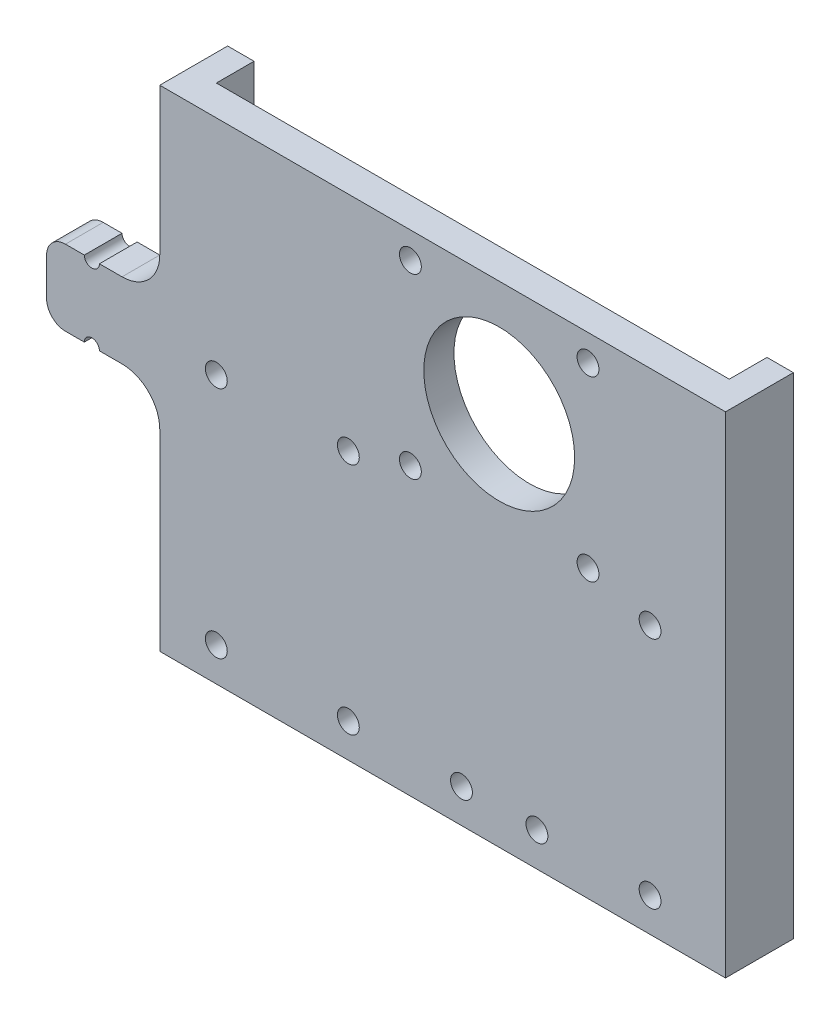
ISO-10303-21;
HEADER;
FILE_DESCRIPTION(('STEP AP214'),'2;1');
FILE_NAME('part.step','',(''),(''),'','','');
FILE_SCHEMA(('AUTOMOTIVE_DESIGN { 1 0 10303 214 1 1 1 1 }'));
ENDSEC;
DATA;
#1=APPLICATION_CONTEXT('core data for automotive mechanical design processes');
#2=APPLICATION_PROTOCOL_DEFINITION('international standard','automotive_design',2000,#1);
#3=PRODUCT_CONTEXT('',#1,'mechanical');
#4=PRODUCT('Part','Part','',(#3));
#5=PRODUCT_RELATED_PRODUCT_CATEGORY('part','',(#4));
#6=PRODUCT_DEFINITION_FORMATION('','',#4);
#7=PRODUCT_DEFINITION_CONTEXT('part definition',#1,'design');
#8=PRODUCT_DEFINITION('design','',#6,#7);
#9=PRODUCT_DEFINITION_SHAPE('','',#8);
#10=(LENGTH_UNIT() NAMED_UNIT(*) SI_UNIT(.MILLI.,.METRE.));
#11=(NAMED_UNIT(*) PLANE_ANGLE_UNIT() SI_UNIT($,.RADIAN.));
#12=(NAMED_UNIT(*) SI_UNIT($,.STERADIAN.) SOLID_ANGLE_UNIT());
#13=UNCERTAINTY_MEASURE_WITH_UNIT(LENGTH_MEASURE(1.E-05),#10,'distance_accuracy_value','');
#14=(GEOMETRIC_REPRESENTATION_CONTEXT(3) GLOBAL_UNCERTAINTY_ASSIGNED_CONTEXT((#13)) GLOBAL_UNIT_ASSIGNED_CONTEXT((#10,
#11,#12)) REPRESENTATION_CONTEXT('',''));
#15=CARTESIAN_POINT('',(0.,0.,0.));
#16=DIRECTION('',(0.,0.,1.));
#17=DIRECTION('',(1.,0.,0.));
#18=AXIS2_PLACEMENT_3D('',#15,#16,#17);
#19=CARTESIAN_POINT('',(-90.,-4.00000000000002,-2.));
#20=DIRECTION('',(0.,-1.,0.));
#21=DIRECTION('',(0.,0.,-1.));
#22=AXIS2_PLACEMENT_3D('',#19,#20,#21);
#23=PLANE('',#22);
#24=DIRECTION('',(0.,0.,-1.));
#25=VECTOR('',#24,1.);
#26=CARTESIAN_POINT('',(-110.,-4.00000000000002,8.001));
#27=LINE('',#26,#25);
#28=CARTESIAN_POINT('',(-110.,-4.00000000000002,8.));
#29=VERTEX_POINT('',#28);
#30=CARTESIAN_POINT('',(-110.,-4.00000000000002,-2.));
#31=VERTEX_POINT('',#30);
#32=EDGE_CURVE('E65',#29,#31,#27,.T.);
#33=ORIENTED_EDGE('',*,*,#32,.F.);
#34=DIRECTION('',(1.,0.,0.));
#35=VECTOR('',#34,1.);
#36=CARTESIAN_POINT('',(-90.,-4.00000000000002,8.));
#37=LINE('',#36,#35);
#38=CARTESIAN_POINT('',(-115.,-4.00000000000002,8.));
#39=VERTEX_POINT('',#38);
#40=EDGE_CURVE('E219',#39,#29,#37,.T.);
#41=ORIENTED_EDGE('',*,*,#40,.F.);
#42=DIRECTION('',(0.,0.,1.));
#43=VECTOR('',#42,1.);
#44=CARTESIAN_POINT('',(-115.,-4.00000000000002,-2.));
#45=LINE('',#44,#43);
#46=CARTESIAN_POINT('',(-115.,-4.00000000000002,-2.));
#47=VERTEX_POINT('',#46);
#48=EDGE_CURVE('E11',#39,#47,#45,.F.);
#49=ORIENTED_EDGE('',*,*,#48,.T.);
#50=DIRECTION('',(1.,0.,0.));
#51=VECTOR('',#50,1.);
#52=CARTESIAN_POINT('',(-90.,-4.00000000000002,-2.));
#53=LINE('',#52,#51);
#54=EDGE_CURVE('E214',#47,#31,#53,.T.);
#55=ORIENTED_EDGE('',*,*,#54,.T.);
#56=EDGE_LOOP('',(#33,#41,#49,#55));
#57=FACE_BOUND('',#56,.T.);
#58=ADVANCED_FACE('F47',(#57),#23,.T.);
#59=CARTESIAN_POINT('',(-90.,16.,-2.));
#60=DIRECTION('',(0.,1.,0.));
#61=DIRECTION('',(0.,0.,1.));
#62=AXIS2_PLACEMENT_3D('',#59,#60,#61);
#63=PLANE('',#62);
#64=DIRECTION('',(0.,0.,-1.));
#65=VECTOR('',#64,1.);
#66=CARTESIAN_POINT('',(-106.,16.,8.001));
#67=LINE('',#66,#65);
#68=CARTESIAN_POINT('',(-106.,16.,8.));
#69=VERTEX_POINT('',#68);
#70=CARTESIAN_POINT('',(-106.,16.,-2.));
#71=VERTEX_POINT('',#70);
#72=EDGE_CURVE('E73',#69,#71,#67,.T.);
#73=ORIENTED_EDGE('',*,*,#72,.F.);
#74=DIRECTION('',(-1.,0.,0.));
#75=VECTOR('',#74,1.);
#76=CARTESIAN_POINT('',(-90.,16.,8.));
#77=LINE('',#76,#75);
#78=CARTESIAN_POINT('',(-100.,16.,8.));
#79=VERTEX_POINT('',#78);
#80=EDGE_CURVE('E202',#79,#69,#77,.T.);
#81=ORIENTED_EDGE('',*,*,#80,.F.);
#82=DIRECTION('',(0.,0.,1.));
#83=VECTOR('',#82,1.);
#84=CARTESIAN_POINT('',(-100.,16.,-2.));
#85=LINE('',#84,#83);
#86=CARTESIAN_POINT('',(-100.,16.,-2.));
#87=VERTEX_POINT('',#86);
#88=EDGE_CURVE('E379',#79,#87,#85,.F.);
#89=ORIENTED_EDGE('',*,*,#88,.T.);
#90=DIRECTION('',(-1.,0.,0.));
#91=VECTOR('',#90,1.);
#92=CARTESIAN_POINT('',(-90.,16.,-2.));
#93=LINE('',#92,#91);
#94=EDGE_CURVE('E442',#87,#71,#93,.T.);
#95=ORIENTED_EDGE('',*,*,#94,.T.);
#96=EDGE_LOOP('',(#73,#81,#89,#95));
#97=FACE_BOUND('',#96,.T.);
#98=ADVANCED_FACE('F495',(#97),#63,.T.);
#99=CARTESIAN_POINT('',(0.,0.,0.));
#100=DIRECTION('',(0.,0.,1.));
#101=DIRECTION('',(1.,0.,0.));
#102=AXIS2_PLACEMENT_3D('',#99,#100,#101);
#103=PLANE('',#102);
#104=CARTESIAN_POINT('',(-75.,5.99999999999998,0.));
#105=DIRECTION('',(0.,0.,1.));
#106=DIRECTION('',(1.,0.,0.));
#107=AXIS2_PLACEMENT_3D('',#104,#105,#106);
#108=CIRCLE('',#107,2.9);
#109=CARTESIAN_POINT('',(-72.1,5.99999999999998,0.));
#110=VERTEX_POINT('',#109);
#111=EDGE_CURVE('E265',#110,#110,#108,.T.);
#112=ORIENTED_EDGE('',*,*,#111,.T.);
#113=EDGE_LOOP('',(#112));
#114=FACE_BOUND('',#113,.T.);
#115=CARTESIAN_POINT('',(-75.,-56.,0.));
#116=DIRECTION('',(0.,0.,1.));
#117=DIRECTION('',(1.,0.,0.));
#118=AXIS2_PLACEMENT_3D('',#115,#116,#117);
#119=CIRCLE('',#118,2.9);
#120=CARTESIAN_POINT('',(-72.1,-56.,0.));
#121=VERTEX_POINT('',#120);
#122=EDGE_CURVE('E271',#121,#121,#119,.T.);
#123=ORIENTED_EDGE('',*,*,#122,.T.);
#124=EDGE_LOOP('',(#123));
#125=FACE_BOUND('',#124,.T.);
#126=CARTESIAN_POINT('',(0.,34.5,0.));
#127=DIRECTION('',(0.,0.,1.));
#128=DIRECTION('',(1.,0.,0.));
#129=AXIS2_PLACEMENT_3D('',#126,#127,#128);
#130=CIRCLE('',#129,20.);
#131=CARTESIAN_POINT('',(20.,34.5,0.));
#132=VERTEX_POINT('',#131);
#133=EDGE_CURVE('E296',#132,#132,#130,.T.);
#134=ORIENTED_EDGE('',*,*,#133,.T.);
#135=EDGE_LOOP('',(#134));
#136=FACE_BOUND('',#135,.T.);
#137=CARTESIAN_POINT('',(-40.,5.99999999999998,0.));
#138=DIRECTION('',(0.,0.,1.));
#139=DIRECTION('',(1.,0.,0.));
#140=AXIS2_PLACEMENT_3D('',#137,#138,#139);
#141=CIRCLE('',#140,2.9);
#142=CARTESIAN_POINT('',(-37.1,5.99999999999998,0.));
#143=VERTEX_POINT('',#142);
#144=EDGE_CURVE('E300',#143,#143,#141,.T.);
#145=ORIENTED_EDGE('',*,*,#144,.T.);
#146=EDGE_LOOP('',(#145));
#147=FACE_BOUND('',#146,.T.);
#148=CARTESIAN_POINT('',(40.,5.99999999999999,0.));
#149=DIRECTION('',(0.,0.,1.));
#150=DIRECTION('',(1.,0.,0.));
#151=AXIS2_PLACEMENT_3D('',#148,#149,#150);
#152=CIRCLE('',#151,2.9);
#153=CARTESIAN_POINT('',(42.9,5.99999999999999,0.));
#154=VERTEX_POINT('',#153);
#155=EDGE_CURVE('E306',#154,#154,#152,.T.);
#156=ORIENTED_EDGE('',*,*,#155,.T.);
#157=EDGE_LOOP('',(#156));
#158=FACE_BOUND('',#157,.T.);
#159=CARTESIAN_POINT('',(-40.,-56.,0.));
#160=DIRECTION('',(0.,0.,1.));
#161=DIRECTION('',(1.,0.,0.));
#162=AXIS2_PLACEMENT_3D('',#159,#160,#161);
#163=CIRCLE('',#162,2.9);
#164=CARTESIAN_POINT('',(-37.1,-56.,0.));
#165=VERTEX_POINT('',#164);
#166=EDGE_CURVE('E312',#165,#165,#163,.T.);
#167=ORIENTED_EDGE('',*,*,#166,.T.);
#168=EDGE_LOOP('',(#167));
#169=FACE_BOUND('',#168,.T.);
#170=CARTESIAN_POINT('',(40.,-56.,0.));
#171=DIRECTION('',(0.,0.,1.));
#172=DIRECTION('',(1.,0.,0.));
#173=AXIS2_PLACEMENT_3D('',#170,#171,#172);
#174=CIRCLE('',#173,2.9);
#175=CARTESIAN_POINT('',(42.9,-56.,0.));
#176=VERTEX_POINT('',#175);
#177=EDGE_CURVE('E318',#176,#176,#174,.T.);
#178=ORIENTED_EDGE('',*,*,#177,.T.);
#179=EDGE_LOOP('',(#178));
#180=FACE_BOUND('',#179,.T.);
#181=CARTESIAN_POINT('',(-23.55,58.,0.));
#182=DIRECTION('',(0.,0.,1.));
#183=DIRECTION('',(1.,0.,0.));
#184=AXIS2_PLACEMENT_3D('',#181,#182,#183);
#185=CIRCLE('',#184,2.9);
#186=CARTESIAN_POINT('',(-20.65,58.,0.));
#187=VERTEX_POINT('',#186);
#188=EDGE_CURVE('E324',#187,#187,#185,.T.);
#189=ORIENTED_EDGE('',*,*,#188,.T.);
#190=EDGE_LOOP('',(#189));
#191=FACE_BOUND('',#190,.T.);
#192=CARTESIAN_POINT('',(23.55,58.,0.));
#193=DIRECTION('',(0.,0.,1.));
#194=DIRECTION('',(1.,0.,0.));
#195=AXIS2_PLACEMENT_3D('',#192,#193,#194);
#196=CIRCLE('',#195,2.9);
#197=CARTESIAN_POINT('',(26.45,58.,0.));
#198=VERTEX_POINT('',#197);
#199=EDGE_CURVE('E330',#198,#198,#196,.T.);
#200=ORIENTED_EDGE('',*,*,#199,.T.);
#201=EDGE_LOOP('',(#200));
#202=FACE_BOUND('',#201,.T.);
#203=CARTESIAN_POINT('',(-23.55,10.9,0.));
#204=DIRECTION('',(0.,0.,1.));
#205=DIRECTION('',(1.,0.,0.));
#206=AXIS2_PLACEMENT_3D('',#203,#204,#205);
#207=CIRCLE('',#206,2.9);
#208=CARTESIAN_POINT('',(-20.65,10.9,0.));
#209=VERTEX_POINT('',#208);
#210=EDGE_CURVE('E336',#209,#209,#207,.T.);
#211=ORIENTED_EDGE('',*,*,#210,.T.);
#212=EDGE_LOOP('',(#211));
#213=FACE_BOUND('',#212,.T.);
#214=CARTESIAN_POINT('',(23.55,10.9,0.));
#215=DIRECTION('',(0.,0.,1.));
#216=DIRECTION('',(1.,0.,0.));
#217=AXIS2_PLACEMENT_3D('',#214,#215,#216);
#218=CIRCLE('',#217,2.9);
#219=CARTESIAN_POINT('',(26.45,10.9,0.));
#220=VERTEX_POINT('',#219);
#221=EDGE_CURVE('E342',#220,#220,#218,.T.);
#222=ORIENTED_EDGE('',*,*,#221,.T.);
#223=EDGE_LOOP('',(#222));
#224=FACE_BOUND('',#223,.T.);
#225=CARTESIAN_POINT('',(-9.99999999999999,-56.,0.));
#226=DIRECTION('',(0.,0.,1.));
#227=DIRECTION('',(1.,0.,0.));
#228=AXIS2_PLACEMENT_3D('',#225,#226,#227);
#229=CIRCLE('',#228,2.9);
#230=CARTESIAN_POINT('',(-7.1,-56.,0.));
#231=VERTEX_POINT('',#230);
#232=EDGE_CURVE('E348',#231,#231,#229,.T.);
#233=ORIENTED_EDGE('',*,*,#232,.T.);
#234=EDGE_LOOP('',(#233));
#235=FACE_BOUND('',#234,.T.);
#236=CARTESIAN_POINT('',(10.,-56.,0.));
#237=DIRECTION('',(0.,0.,1.));
#238=DIRECTION('',(1.,0.,0.));
#239=AXIS2_PLACEMENT_3D('',#236,#237,#238);
#240=CIRCLE('',#239,2.9);
#241=CARTESIAN_POINT('',(12.9,-56.,0.));
#242=VERTEX_POINT('',#241);
#243=EDGE_CURVE('E354',#242,#242,#240,.T.);
#244=ORIENTED_EDGE('',*,*,#243,.T.);
#245=EDGE_LOOP('',(#244));
#246=FACE_BOUND('',#245,.T.);
#247=DIRECTION('',(0.,1.,0.));
#248=VECTOR('',#247,1.);
#249=CARTESIAN_POINT('',(53.,65.,0.));
#250=LINE('',#249,#248);
#251=CARTESIAN_POINT('',(53.,-65.,0.));
#252=VERTEX_POINT('',#251);
#253=CARTESIAN_POINT('',(53.,65.,0.));
#254=VERTEX_POINT('',#253);
#255=EDGE_CURVE('E227',#252,#254,#250,.T.);
#256=ORIENTED_EDGE('',*,*,#255,.F.);
#257=DIRECTION('',(1.,0.,0.));
#258=VECTOR('',#257,1.);
#259=CARTESIAN_POINT('',(-50.,-65.,0.));
#260=LINE('',#259,#258);
#261=CARTESIAN_POINT('',(-83.,-65.,0.));
#262=VERTEX_POINT('',#261);
#263=EDGE_CURVE('E361',#262,#252,#260,.T.);
#264=ORIENTED_EDGE('',*,*,#263,.F.);
#265=DIRECTION('',(0.,-1.,0.));
#266=VECTOR('',#265,1.);
#267=CARTESIAN_POINT('',(-83.,65.,0.));
#268=LINE('',#267,#266);
#269=CARTESIAN_POINT('',(-83.,65.,0.));
#270=VERTEX_POINT('',#269);
#271=EDGE_CURVE('E237',#270,#262,#268,.T.);
#272=ORIENTED_EDGE('',*,*,#271,.F.);
#273=DIRECTION('',(-1.,0.,0.));
#274=VECTOR('',#273,1.);
#275=CARTESIAN_POINT('',(-50.,65.,0.));
#276=LINE('',#275,#274);
#277=EDGE_CURVE('E357',#254,#270,#276,.T.);
#278=ORIENTED_EDGE('',*,*,#277,.F.);
#279=EDGE_LOOP('',(#256,#264,#272,#278));
#280=FACE_BOUND('',#279,.T.);
#281=ADVANCED_FACE('F499',(#114,#125,#136,#147,#158,#169,#180,#191,#202,#213,#224,#235,#246,
#280),#103,.F.);
#282=CARTESIAN_POINT('',(-50.,65.,8.));
#283=DIRECTION('',(0.,-1.,0.));
#284=DIRECTION('',(0.,0.,-1.));
#285=AXIS2_PLACEMENT_3D('',#282,#283,#284);
#286=PLANE('',#285);
#287=DIRECTION('',(0.,0.,1.));
#288=VECTOR('',#287,1.);
#289=CARTESIAN_POINT('',(60.,65.,-136.014705087354));
#290=LINE('',#289,#288);
#291=CARTESIAN_POINT('',(60.,65.,-10.));
#292=VERTEX_POINT('',#291);
#293=CARTESIAN_POINT('',(60.,65.,8.));
#294=VERTEX_POINT('',#293);
#295=EDGE_CURVE('E274',#292,#294,#290,.T.);
#296=ORIENTED_EDGE('',*,*,#295,.F.);
#297=DIRECTION('',(1.,0.,0.));
#298=VECTOR('',#297,1.);
#299=CARTESIAN_POINT('',(60.,65.,-10.));
#300=LINE('',#299,#298);
#301=CARTESIAN_POINT('',(53.,65.,-10.));
#302=VERTEX_POINT('',#301);
#303=EDGE_CURVE('E231',#302,#292,#300,.T.);
#304=ORIENTED_EDGE('',*,*,#303,.F.);
#305=DIRECTION('',(0.,0.,1.));
#306=VECTOR('',#305,1.);
#307=CARTESIAN_POINT('',(53.,65.,-10.));
#308=LINE('',#307,#306);
#309=EDGE_CURVE('E234',#302,#254,#308,.T.);
#310=ORIENTED_EDGE('',*,*,#309,.T.);
#311=ORIENTED_EDGE('',*,*,#277,.T.);
#312=DIRECTION('',(0.,0.,1.));
#313=VECTOR('',#312,1.);
#314=CARTESIAN_POINT('',(-83.,65.,-10.));
#315=LINE('',#314,#313);
#316=CARTESIAN_POINT('',(-83.,65.,-10.));
#317=VERTEX_POINT('',#316);
#318=EDGE_CURVE('E244',#317,#270,#315,.T.);
#319=ORIENTED_EDGE('',*,*,#318,.F.);
#320=DIRECTION('',(1.,0.,0.));
#321=VECTOR('',#320,1.);
#322=CARTESIAN_POINT('',(-90.,65.,-10.));
#323=LINE('',#322,#321);
#324=CARTESIAN_POINT('',(-90.,65.,-10.));
#325=VERTEX_POINT('',#324);
#326=EDGE_CURVE('E258',#325,#317,#323,.T.);
#327=ORIENTED_EDGE('',*,*,#326,.F.);
#328=DIRECTION('',(0.,0.,1.));
#329=VECTOR('',#328,1.);
#330=CARTESIAN_POINT('',(-90.,65.,-136.014705087354));
#331=LINE('',#330,#329);
#332=CARTESIAN_POINT('',(-90.,65.,8.));
#333=VERTEX_POINT('',#332);
#334=EDGE_CURVE('E278',#325,#333,#331,.T.);
#335=ORIENTED_EDGE('',*,*,#334,.T.);
#336=DIRECTION('',(-1.,0.,0.));
#337=VECTOR('',#336,1.);
#338=CARTESIAN_POINT('',(-50.,65.,8.));
#339=LINE('',#338,#337);
#340=EDGE_CURVE('E358',#294,#333,#339,.T.);
#341=ORIENTED_EDGE('',*,*,#340,.F.);
#342=EDGE_LOOP('',(#296,#304,#310,#311,#319,#327,#335,#341));
#343=FACE_BOUND('',#342,.T.);
#344=ADVANCED_FACE('F488',(#343),#286,.F.);
#345=CARTESIAN_POINT('',(-50.,-65.,8.));
#346=DIRECTION('',(0.,1.,0.));
#347=DIRECTION('',(0.,0.,1.));
#348=AXIS2_PLACEMENT_3D('',#345,#346,#347);
#349=PLANE('',#348);
#350=DIRECTION('',(0.,0.,1.));
#351=VECTOR('',#350,1.);
#352=CARTESIAN_POINT('',(-90.,-65.,-136.014705087354));
#353=LINE('',#352,#351);
#354=CARTESIAN_POINT('',(-90.,-65.,-10.));
#355=VERTEX_POINT('',#354);
#356=CARTESIAN_POINT('',(-90.,-65.,8.));
#357=VERTEX_POINT('',#356);
#358=EDGE_CURVE('E280',#355,#357,#353,.T.);
#359=ORIENTED_EDGE('',*,*,#358,.F.);
#360=DIRECTION('',(-1.,0.,0.));
#361=VECTOR('',#360,1.);
#362=CARTESIAN_POINT('',(-90.,-65.,-10.));
#363=LINE('',#362,#361);
#364=CARTESIAN_POINT('',(-83.,-65.,-10.));
#365=VERTEX_POINT('',#364);
#366=EDGE_CURVE('E250',#365,#355,#363,.T.);
#367=ORIENTED_EDGE('',*,*,#366,.F.);
#368=DIRECTION('',(0.,0.,1.));
#369=VECTOR('',#368,1.);
#370=CARTESIAN_POINT('',(-83.,-65.,-10.));
#371=LINE('',#370,#369);
#372=EDGE_CURVE('E247',#365,#262,#371,.T.);
#373=ORIENTED_EDGE('',*,*,#372,.T.);
#374=ORIENTED_EDGE('',*,*,#263,.T.);
#375=DIRECTION('',(0.,0.,1.));
#376=VECTOR('',#375,1.);
#377=CARTESIAN_POINT('',(53.,-65.,-10.));
#378=LINE('',#377,#376);
#379=CARTESIAN_POINT('',(53.,-65.,-10.));
#380=VERTEX_POINT('',#379);
#381=EDGE_CURVE('E240',#380,#252,#378,.T.);
#382=ORIENTED_EDGE('',*,*,#381,.F.);
#383=DIRECTION('',(-1.,0.,0.));
#384=VECTOR('',#383,1.);
#385=CARTESIAN_POINT('',(60.,-65.,-10.));
#386=LINE('',#385,#384);
#387=CARTESIAN_POINT('',(60.,-65.,-10.));
#388=VERTEX_POINT('',#387);
#389=EDGE_CURVE('E226',#388,#380,#386,.T.);
#390=ORIENTED_EDGE('',*,*,#389,.F.);
#391=DIRECTION('',(0.,0.,1.));
#392=VECTOR('',#391,1.);
#393=CARTESIAN_POINT('',(60.,-65.,-136.014705087354));
#394=LINE('',#393,#392);
#395=CARTESIAN_POINT('',(60.,-65.,8.));
#396=VERTEX_POINT('',#395);
#397=EDGE_CURVE('E286',#388,#396,#394,.T.);
#398=ORIENTED_EDGE('',*,*,#397,.T.);
#399=DIRECTION('',(1.,0.,0.));
#400=VECTOR('',#399,1.);
#401=CARTESIAN_POINT('',(-50.,-65.,8.));
#402=LINE('',#401,#400);
#403=EDGE_CURVE('E360',#357,#396,#402,.T.);
#404=ORIENTED_EDGE('',*,*,#403,.F.);
#405=EDGE_LOOP('',(#359,#367,#373,#374,#382,#390,#398,#404));
#406=FACE_BOUND('',#405,.T.);
#407=ADVANCED_FACE('F463',(#406),#349,.F.);
#408=CARTESIAN_POINT('',(0.,0.,8.));
#409=DIRECTION('',(0.,0.,1.));
#410=DIRECTION('',(1.,0.,0.));
#411=AXIS2_PLACEMENT_3D('',#408,#409,#410);
#412=PLANE('',#411);
#413=CARTESIAN_POINT('',(-108.,16.,8.));
#414=DIRECTION('',(0.,0.,1.));
#415=DIRECTION('',(1.,0.,0.));
#416=AXIS2_PLACEMENT_3D('',#413,#414,#415);
#417=CIRCLE('',#416,2.);
#418=CARTESIAN_POINT('',(-110.,16.,8.));
#419=VERTEX_POINT('',#418);
#420=EDGE_CURVE('E189',#69,#419,#417,.F.);
#421=ORIENTED_EDGE('',*,*,#420,.T.);
#422=CARTESIAN_POINT('',(-115.,16.,8.));
#423=VERTEX_POINT('',#422);
#424=EDGE_CURVE('E199',#419,#423,#77,.T.);
#425=ORIENTED_EDGE('',*,*,#424,.T.);
#426=CARTESIAN_POINT('',(-115.,11.,8.));
#427=DIRECTION('',(0.,0.,1.));
#428=DIRECTION('',(1.,0.,0.));
#429=AXIS2_PLACEMENT_3D('',#426,#427,#428);
#430=CIRCLE('',#429,5.);
#431=CARTESIAN_POINT('',(-120.,11.,8.));
#432=VERTEX_POINT('',#431);
#433=EDGE_CURVE('E396',#423,#432,#430,.T.);
#434=ORIENTED_EDGE('',*,*,#433,.T.);
#435=DIRECTION('',(0.,-1.,0.));
#436=VECTOR('',#435,1.);
#437=CARTESIAN_POINT('',(-120.,16.,8.));
#438=LINE('',#437,#436);
#439=CARTESIAN_POINT('',(-120.,0.999999999999984,8.));
#440=VERTEX_POINT('',#439);
#441=EDGE_CURVE('E210',#432,#440,#438,.T.);
#442=ORIENTED_EDGE('',*,*,#441,.T.);
#443=CARTESIAN_POINT('',(-115.,0.999999999999984,8.));
#444=DIRECTION('',(0.,0.,1.));
#445=DIRECTION('',(1.,0.,0.));
#446=AXIS2_PLACEMENT_3D('',#443,#444,#445);
#447=CIRCLE('',#446,5.);
#448=EDGE_CURVE('E394',#440,#39,#447,.T.);
#449=ORIENTED_EDGE('',*,*,#448,.T.);
#450=ORIENTED_EDGE('',*,*,#40,.T.);
#451=CARTESIAN_POINT('',(-108.,-4.00000000000002,8.));
#452=DIRECTION('',(0.,0.,1.));
#453=DIRECTION('',(1.,0.,0.));
#454=AXIS2_PLACEMENT_3D('',#451,#452,#453);
#455=CIRCLE('',#454,2.);
#456=CARTESIAN_POINT('',(-106.,-4.00000000000002,8.));
#457=VERTEX_POINT('',#456);
#458=EDGE_CURVE('E203',#29,#457,#455,.F.);
#459=ORIENTED_EDGE('',*,*,#458,.T.);
#460=CARTESIAN_POINT('',(-100.,-4.00000000000002,8.));
#461=VERTEX_POINT('',#460);
#462=EDGE_CURVE('E218',#457,#461,#37,.T.);
#463=ORIENTED_EDGE('',*,*,#462,.T.);
#464=CARTESIAN_POINT('',(-100.,-14.,8.));
#465=DIRECTION('',(0.,0.,1.));
#466=DIRECTION('',(1.,0.,0.));
#467=AXIS2_PLACEMENT_3D('',#464,#465,#466);
#468=CIRCLE('',#467,10.);
#469=CARTESIAN_POINT('',(-90.,-14.,8.));
#470=VERTEX_POINT('',#469);
#471=EDGE_CURVE('E381',#461,#470,#468,.F.);
#472=ORIENTED_EDGE('',*,*,#471,.T.);
#473=DIRECTION('',(0.,-1.,0.));
#474=VECTOR('',#473,1.);
#475=CARTESIAN_POINT('',(-90.,65.,8.));
#476=LINE('',#475,#474);
#477=EDGE_CURVE('E279',#470,#357,#476,.T.);
#478=ORIENTED_EDGE('',*,*,#477,.T.);
#479=ORIENTED_EDGE('',*,*,#403,.T.);
#480=DIRECTION('',(0.,1.,0.));
#481=VECTOR('',#480,1.);
#482=CARTESIAN_POINT('',(60.,65.,8.));
#483=LINE('',#482,#481);
#484=EDGE_CURVE('E289',#396,#294,#483,.T.);
#485=ORIENTED_EDGE('',*,*,#484,.T.);
#486=ORIENTED_EDGE('',*,*,#340,.T.);
#487=CARTESIAN_POINT('',(-90.,26.,8.));
#488=VERTEX_POINT('',#487);
#489=EDGE_CURVE('E275',#333,#488,#476,.T.);
#490=ORIENTED_EDGE('',*,*,#489,.T.);
#491=CARTESIAN_POINT('',(-100.,26.,8.00000000000001));
#492=DIRECTION('',(0.,0.,1.));
#493=DIRECTION('',(1.,0.,0.));
#494=AXIS2_PLACEMENT_3D('',#491,#492,#493);
#495=CIRCLE('',#494,10.);
#496=EDGE_CURVE('E388',#488,#79,#495,.F.);
#497=ORIENTED_EDGE('',*,*,#496,.T.);
#498=ORIENTED_EDGE('',*,*,#80,.T.);
#499=EDGE_LOOP('',(#421,#425,#434,#442,#449,#450,#459,#463,#472,#478,#479,#485,#486,#490,#497,#498));
#500=FACE_BOUND('',#499,.T.);
#501=CARTESIAN_POINT('',(-75.,5.99999999999998,8.));
#502=DIRECTION('',(0.,0.,1.));
#503=DIRECTION('',(1.,0.,0.));
#504=AXIS2_PLACEMENT_3D('',#501,#502,#503);
#505=CIRCLE('',#504,2.9);
#506=CARTESIAN_POINT('',(-72.1,5.99999999999998,8.));
#507=VERTEX_POINT('',#506);
#508=EDGE_CURVE('E243',#507,#507,#505,.T.);
#509=ORIENTED_EDGE('',*,*,#508,.F.);
#510=EDGE_LOOP('',(#509));
#511=FACE_BOUND('',#510,.T.);
#512=CARTESIAN_POINT('',(-75.,-56.,8.));
#513=DIRECTION('',(0.,0.,1.));
#514=DIRECTION('',(1.,0.,0.));
#515=AXIS2_PLACEMENT_3D('',#512,#513,#514);
#516=CIRCLE('',#515,2.9);
#517=CARTESIAN_POINT('',(-72.1,-56.,8.));
#518=VERTEX_POINT('',#517);
#519=EDGE_CURVE('E268',#518,#518,#516,.T.);
#520=ORIENTED_EDGE('',*,*,#519,.F.);
#521=EDGE_LOOP('',(#520));
#522=FACE_BOUND('',#521,.T.);
#523=CARTESIAN_POINT('',(0.,34.5,8.));
#524=DIRECTION('',(0.,0.,1.));
#525=DIRECTION('',(1.,0.,0.));
#526=AXIS2_PLACEMENT_3D('',#523,#524,#525);
#527=CIRCLE('',#526,20.);
#528=CARTESIAN_POINT('',(20.,34.5,8.));
#529=VERTEX_POINT('',#528);
#530=EDGE_CURVE('E283',#529,#529,#527,.T.);
#531=ORIENTED_EDGE('',*,*,#530,.F.);
#532=EDGE_LOOP('',(#531));
#533=FACE_BOUND('',#532,.T.);
#534=CARTESIAN_POINT('',(-40.,5.99999999999998,8.));
#535=DIRECTION('',(0.,0.,1.));
#536=DIRECTION('',(1.,0.,0.));
#537=AXIS2_PLACEMENT_3D('',#534,#535,#536);
#538=CIRCLE('',#537,2.9);
#539=CARTESIAN_POINT('',(-37.1,5.99999999999998,8.));
#540=VERTEX_POINT('',#539);
#541=EDGE_CURVE('E297',#540,#540,#538,.T.);
#542=ORIENTED_EDGE('',*,*,#541,.F.);
#543=EDGE_LOOP('',(#542));
#544=FACE_BOUND('',#543,.T.);
#545=CARTESIAN_POINT('',(40.,5.99999999999999,8.));
#546=DIRECTION('',(0.,0.,1.));
#547=DIRECTION('',(1.,0.,0.));
#548=AXIS2_PLACEMENT_3D('',#545,#546,#547);
#549=CIRCLE('',#548,2.9);
#550=CARTESIAN_POINT('',(42.9,5.99999999999999,8.));
#551=VERTEX_POINT('',#550);
#552=EDGE_CURVE('E303',#551,#551,#549,.T.);
#553=ORIENTED_EDGE('',*,*,#552,.F.);
#554=EDGE_LOOP('',(#553));
#555=FACE_BOUND('',#554,.T.);
#556=CARTESIAN_POINT('',(-40.,-56.,8.));
#557=DIRECTION('',(0.,0.,1.));
#558=DIRECTION('',(1.,0.,0.));
#559=AXIS2_PLACEMENT_3D('',#556,#557,#558);
#560=CIRCLE('',#559,2.9);
#561=CARTESIAN_POINT('',(-37.1,-56.,8.));
#562=VERTEX_POINT('',#561);
#563=EDGE_CURVE('E309',#562,#562,#560,.T.);
#564=ORIENTED_EDGE('',*,*,#563,.F.);
#565=EDGE_LOOP('',(#564));
#566=FACE_BOUND('',#565,.T.);
#567=CARTESIAN_POINT('',(40.,-56.,8.));
#568=DIRECTION('',(0.,0.,1.));
#569=DIRECTION('',(1.,0.,0.));
#570=AXIS2_PLACEMENT_3D('',#567,#568,#569);
#571=CIRCLE('',#570,2.9);
#572=CARTESIAN_POINT('',(42.9,-56.,8.));
#573=VERTEX_POINT('',#572);
#574=EDGE_CURVE('E315',#573,#573,#571,.T.);
#575=ORIENTED_EDGE('',*,*,#574,.F.);
#576=EDGE_LOOP('',(#575));
#577=FACE_BOUND('',#576,.T.);
#578=CARTESIAN_POINT('',(-23.55,58.,8.));
#579=DIRECTION('',(0.,0.,1.));
#580=DIRECTION('',(1.,0.,0.));
#581=AXIS2_PLACEMENT_3D('',#578,#579,#580);
#582=CIRCLE('',#581,2.9);
#583=CARTESIAN_POINT('',(-20.65,58.,8.));
#584=VERTEX_POINT('',#583);
#585=EDGE_CURVE('E321',#584,#584,#582,.T.);
#586=ORIENTED_EDGE('',*,*,#585,.F.);
#587=EDGE_LOOP('',(#586));
#588=FACE_BOUND('',#587,.T.);
#589=CARTESIAN_POINT('',(23.55,58.,8.));
#590=DIRECTION('',(0.,0.,1.));
#591=DIRECTION('',(1.,0.,0.));
#592=AXIS2_PLACEMENT_3D('',#589,#590,#591);
#593=CIRCLE('',#592,2.9);
#594=CARTESIAN_POINT('',(26.45,58.,8.));
#595=VERTEX_POINT('',#594);
#596=EDGE_CURVE('E327',#595,#595,#593,.T.);
#597=ORIENTED_EDGE('',*,*,#596,.F.);
#598=EDGE_LOOP('',(#597));
#599=FACE_BOUND('',#598,.T.);
#600=CARTESIAN_POINT('',(-23.55,10.9,8.));
#601=DIRECTION('',(0.,0.,1.));
#602=DIRECTION('',(1.,0.,0.));
#603=AXIS2_PLACEMENT_3D('',#600,#601,#602);
#604=CIRCLE('',#603,2.9);
#605=CARTESIAN_POINT('',(-20.65,10.9,8.));
#606=VERTEX_POINT('',#605);
#607=EDGE_CURVE('E333',#606,#606,#604,.T.);
#608=ORIENTED_EDGE('',*,*,#607,.F.);
#609=EDGE_LOOP('',(#608));
#610=FACE_BOUND('',#609,.T.);
#611=CARTESIAN_POINT('',(23.55,10.9,8.));
#612=DIRECTION('',(0.,0.,1.));
#613=DIRECTION('',(1.,0.,0.));
#614=AXIS2_PLACEMENT_3D('',#611,#612,#613);
#615=CIRCLE('',#614,2.9);
#616=CARTESIAN_POINT('',(26.45,10.9,8.));
#617=VERTEX_POINT('',#616);
#618=EDGE_CURVE('E339',#617,#617,#615,.T.);
#619=ORIENTED_EDGE('',*,*,#618,.F.);
#620=EDGE_LOOP('',(#619));
#621=FACE_BOUND('',#620,.T.);
#622=CARTESIAN_POINT('',(-9.99999999999999,-56.,8.));
#623=DIRECTION('',(0.,0.,1.));
#624=DIRECTION('',(1.,0.,0.));
#625=AXIS2_PLACEMENT_3D('',#622,#623,#624);
#626=CIRCLE('',#625,2.9);
#627=CARTESIAN_POINT('',(-7.09999999999999,-56.,8.));
#628=VERTEX_POINT('',#627);
#629=EDGE_CURVE('E345',#628,#628,#626,.T.);
#630=ORIENTED_EDGE('',*,*,#629,.F.);
#631=EDGE_LOOP('',(#630));
#632=FACE_BOUND('',#631,.T.);
#633=CARTESIAN_POINT('',(10.,-56.,8.));
#634=DIRECTION('',(0.,0.,1.));
#635=DIRECTION('',(1.,0.,0.));
#636=AXIS2_PLACEMENT_3D('',#633,#634,#635);
#637=CIRCLE('',#636,2.9);
#638=CARTESIAN_POINT('',(12.9,-56.,8.));
#639=VERTEX_POINT('',#638);
#640=EDGE_CURVE('E351',#639,#639,#637,.T.);
#641=ORIENTED_EDGE('',*,*,#640,.F.);
#642=EDGE_LOOP('',(#641));
#643=FACE_BOUND('',#642,.T.);
#644=ADVANCED_FACE('F197',(#500,#511,#522,#533,#544,#555,#566,#577,#588,#599,#610,#621,#632,
#643),#412,.T.);
#645=CARTESIAN_POINT('',(10.,-56.,8.));
#646=DIRECTION('',(0.,0.,1.));
#647=DIRECTION('',(1.,0.,0.));
#648=AXIS2_PLACEMENT_3D('',#645,#646,#647);
#649=CYLINDRICAL_SURFACE('',#648,2.9);
#650=ORIENTED_EDGE('',*,*,#243,.F.);
#651=EDGE_LOOP('',(#650));
#652=FACE_BOUND('',#651,.T.);
#653=ORIENTED_EDGE('',*,*,#640,.T.);
#654=EDGE_LOOP('',(#653));
#655=FACE_BOUND('',#654,.T.);
#656=ADVANCED_FACE('F546',(#652,#655),#649,.F.);
#657=CARTESIAN_POINT('',(-9.99999999999999,-56.,8.));
#658=DIRECTION('',(0.,0.,1.));
#659=DIRECTION('',(1.,0.,0.));
#660=AXIS2_PLACEMENT_3D('',#657,#658,#659);
#661=CYLINDRICAL_SURFACE('',#660,2.9);
#662=ORIENTED_EDGE('',*,*,#232,.F.);
#663=EDGE_LOOP('',(#662));
#664=FACE_BOUND('',#663,.T.);
#665=ORIENTED_EDGE('',*,*,#629,.T.);
#666=EDGE_LOOP('',(#665));
#667=FACE_BOUND('',#666,.T.);
#668=ADVANCED_FACE('F613',(#664,#667),#661,.F.);
#669=CARTESIAN_POINT('',(23.55,10.9,8.));
#670=DIRECTION('',(0.,0.,1.));
#671=DIRECTION('',(1.,0.,0.));
#672=AXIS2_PLACEMENT_3D('',#669,#670,#671);
#673=CYLINDRICAL_SURFACE('',#672,2.9);
#674=ORIENTED_EDGE('',*,*,#221,.F.);
#675=EDGE_LOOP('',(#674));
#676=FACE_BOUND('',#675,.T.);
#677=ORIENTED_EDGE('',*,*,#618,.T.);
#678=EDGE_LOOP('',(#677));
#679=FACE_BOUND('',#678,.T.);
#680=ADVANCED_FACE('F617',(#676,#679),#673,.F.);
#681=CARTESIAN_POINT('',(-23.55,10.9,8.));
#682=DIRECTION('',(0.,0.,1.));
#683=DIRECTION('',(1.,0.,0.));
#684=AXIS2_PLACEMENT_3D('',#681,#682,#683);
#685=CYLINDRICAL_SURFACE('',#684,2.9);
#686=ORIENTED_EDGE('',*,*,#210,.F.);
#687=EDGE_LOOP('',(#686));
#688=FACE_BOUND('',#687,.T.);
#689=ORIENTED_EDGE('',*,*,#607,.T.);
#690=EDGE_LOOP('',(#689));
#691=FACE_BOUND('',#690,.T.);
#692=ADVANCED_FACE('F621',(#688,#691),#685,.F.);
#693=CARTESIAN_POINT('',(23.55,58.,8.));
#694=DIRECTION('',(0.,0.,1.));
#695=DIRECTION('',(1.,0.,0.));
#696=AXIS2_PLACEMENT_3D('',#693,#694,#695);
#697=CYLINDRICAL_SURFACE('',#696,2.9);
#698=ORIENTED_EDGE('',*,*,#199,.F.);
#699=EDGE_LOOP('',(#698));
#700=FACE_BOUND('',#699,.T.);
#701=ORIENTED_EDGE('',*,*,#596,.T.);
#702=EDGE_LOOP('',(#701));
#703=FACE_BOUND('',#702,.T.);
#704=ADVANCED_FACE('F625',(#700,#703),#697,.F.);
#705=CARTESIAN_POINT('',(-23.55,58.,8.));
#706=DIRECTION('',(0.,0.,1.));
#707=DIRECTION('',(1.,0.,0.));
#708=AXIS2_PLACEMENT_3D('',#705,#706,#707);
#709=CYLINDRICAL_SURFACE('',#708,2.9);
#710=ORIENTED_EDGE('',*,*,#188,.F.);
#711=EDGE_LOOP('',(#710));
#712=FACE_BOUND('',#711,.T.);
#713=ORIENTED_EDGE('',*,*,#585,.T.);
#714=EDGE_LOOP('',(#713));
#715=FACE_BOUND('',#714,.T.);
#716=ADVANCED_FACE('F629',(#712,#715),#709,.F.);
#717=CARTESIAN_POINT('',(40.,-56.,8.));
#718=DIRECTION('',(0.,0.,1.));
#719=DIRECTION('',(1.,0.,0.));
#720=AXIS2_PLACEMENT_3D('',#717,#718,#719);
#721=CYLINDRICAL_SURFACE('',#720,2.9);
#722=ORIENTED_EDGE('',*,*,#177,.F.);
#723=EDGE_LOOP('',(#722));
#724=FACE_BOUND('',#723,.T.);
#725=ORIENTED_EDGE('',*,*,#574,.T.);
#726=EDGE_LOOP('',(#725));
#727=FACE_BOUND('',#726,.T.);
#728=ADVANCED_FACE('F633',(#724,#727),#721,.F.);
#729=CARTESIAN_POINT('',(-40.,-56.,8.));
#730=DIRECTION('',(0.,0.,1.));
#731=DIRECTION('',(1.,0.,0.));
#732=AXIS2_PLACEMENT_3D('',#729,#730,#731);
#733=CYLINDRICAL_SURFACE('',#732,2.9);
#734=ORIENTED_EDGE('',*,*,#166,.F.);
#735=EDGE_LOOP('',(#734));
#736=FACE_BOUND('',#735,.T.);
#737=ORIENTED_EDGE('',*,*,#563,.T.);
#738=EDGE_LOOP('',(#737));
#739=FACE_BOUND('',#738,.T.);
#740=ADVANCED_FACE('F637',(#736,#739),#733,.F.);
#741=CARTESIAN_POINT('',(40.,5.99999999999999,8.));
#742=DIRECTION('',(0.,0.,1.));
#743=DIRECTION('',(1.,0.,0.));
#744=AXIS2_PLACEMENT_3D('',#741,#742,#743);
#745=CYLINDRICAL_SURFACE('',#744,2.9);
#746=ORIENTED_EDGE('',*,*,#155,.F.);
#747=EDGE_LOOP('',(#746));
#748=FACE_BOUND('',#747,.T.);
#749=ORIENTED_EDGE('',*,*,#552,.T.);
#750=EDGE_LOOP('',(#749));
#751=FACE_BOUND('',#750,.T.);
#752=ADVANCED_FACE('F641',(#748,#751),#745,.F.);
#753=CARTESIAN_POINT('',(-40.,5.99999999999998,8.));
#754=DIRECTION('',(0.,0.,1.));
#755=DIRECTION('',(1.,0.,0.));
#756=AXIS2_PLACEMENT_3D('',#753,#754,#755);
#757=CYLINDRICAL_SURFACE('',#756,2.9);
#758=ORIENTED_EDGE('',*,*,#144,.F.);
#759=EDGE_LOOP('',(#758));
#760=FACE_BOUND('',#759,.T.);
#761=ORIENTED_EDGE('',*,*,#541,.T.);
#762=EDGE_LOOP('',(#761));
#763=FACE_BOUND('',#762,.T.);
#764=ADVANCED_FACE('F645',(#760,#763),#757,.F.);
#765=CARTESIAN_POINT('',(0.,34.5,-2.));
#766=DIRECTION('',(0.,0.,1.));
#767=DIRECTION('',(1.,0.,0.));
#768=AXIS2_PLACEMENT_3D('',#765,#766,#767);
#769=CYLINDRICAL_SURFACE('',#768,20.);
#770=ORIENTED_EDGE('',*,*,#530,.T.);
#771=EDGE_LOOP('',(#770));
#772=FACE_BOUND('',#771,.T.);
#773=ORIENTED_EDGE('',*,*,#133,.F.);
#774=EDGE_LOOP('',(#773));
#775=FACE_BOUND('',#774,.T.);
#776=ADVANCED_FACE('F649',(#772,#775),#769,.F.);
#777=CARTESIAN_POINT('',(-90.,65.,-136.014705087354));
#778=DIRECTION('',(-1.,0.,0.));
#779=DIRECTION('',(0.,-1.,0.));
#780=AXIS2_PLACEMENT_3D('',#777,#778,#779);
#781=PLANE('',#780);
#782=ORIENTED_EDGE('',*,*,#477,.F.);
#783=DIRECTION('',(0.,0.,1.));
#784=VECTOR('',#783,1.);
#785=CARTESIAN_POINT('',(-90.,-14.,-2.));
#786=LINE('',#785,#784);
#787=CARTESIAN_POINT('',(-90.,-14.,-2.));
#788=VERTEX_POINT('',#787);
#789=EDGE_CURVE('E376',#470,#788,#786,.F.);
#790=ORIENTED_EDGE('',*,*,#789,.T.);
#791=DIRECTION('',(0.,1.,0.));
#792=VECTOR('',#791,1.);
#793=CARTESIAN_POINT('',(-90.,16.,-2.));
#794=LINE('',#793,#792);
#795=CARTESIAN_POINT('',(-90.,26.,-2.));
#796=VERTEX_POINT('',#795);
#797=EDGE_CURVE('E222',#788,#796,#794,.T.);
#798=ORIENTED_EDGE('',*,*,#797,.T.);
#799=DIRECTION('',(0.,0.,1.));
#800=VECTOR('',#799,1.);
#801=CARTESIAN_POINT('',(-90.,26.,8.00000000000001));
#802=LINE('',#801,#800);
#803=EDGE_CURVE('E373',#796,#488,#802,.T.);
#804=ORIENTED_EDGE('',*,*,#803,.T.);
#805=ORIENTED_EDGE('',*,*,#489,.F.);
#806=ORIENTED_EDGE('',*,*,#334,.F.);
#807=DIRECTION('',(0.,1.,0.));
#808=VECTOR('',#807,1.);
#809=CARTESIAN_POINT('',(-90.,65.,-10.));
#810=LINE('',#809,#808);
#811=EDGE_CURVE('E253',#355,#325,#810,.T.);
#812=ORIENTED_EDGE('',*,*,#811,.F.);
#813=ORIENTED_EDGE('',*,*,#358,.T.);
#814=EDGE_LOOP('',(#782,#790,#798,#804,#805,#806,#812,#813));
#815=FACE_BOUND('',#814,.T.);
#816=ADVANCED_FACE('F459',(#815),#781,.T.);
#817=CARTESIAN_POINT('',(60.,65.,-136.014705087354));
#818=DIRECTION('',(1.,0.,0.));
#819=DIRECTION('',(0.,1.,0.));
#820=AXIS2_PLACEMENT_3D('',#817,#818,#819);
#821=PLANE('',#820);
#822=ORIENTED_EDGE('',*,*,#397,.F.);
#823=DIRECTION('',(0.,-1.,0.));
#824=VECTOR('',#823,1.);
#825=CARTESIAN_POINT('',(60.,65.,-10.));
#826=LINE('',#825,#824);
#827=EDGE_CURVE('E223',#292,#388,#826,.T.);
#828=ORIENTED_EDGE('',*,*,#827,.F.);
#829=ORIENTED_EDGE('',*,*,#295,.T.);
#830=ORIENTED_EDGE('',*,*,#484,.F.);
#831=EDGE_LOOP('',(#822,#828,#829,#830));
#832=FACE_BOUND('',#831,.T.);
#833=ADVANCED_FACE('F485',(#832),#821,.T.);
#834=CARTESIAN_POINT('',(-75.,-56.,8.));
#835=DIRECTION('',(0.,0.,1.));
#836=DIRECTION('',(1.,0.,0.));
#837=AXIS2_PLACEMENT_3D('',#834,#835,#836);
#838=CYLINDRICAL_SURFACE('',#837,2.9);
#839=ORIENTED_EDGE('',*,*,#122,.F.);
#840=EDGE_LOOP('',(#839));
#841=FACE_BOUND('',#840,.T.);
#842=ORIENTED_EDGE('',*,*,#519,.T.);
#843=EDGE_LOOP('',(#842));
#844=FACE_BOUND('',#843,.T.);
#845=ADVANCED_FACE('F656',(#841,#844),#838,.F.);
#846=CARTESIAN_POINT('',(-75.,5.99999999999998,8.));
#847=DIRECTION('',(0.,0.,1.));
#848=DIRECTION('',(1.,0.,0.));
#849=AXIS2_PLACEMENT_3D('',#846,#847,#848);
#850=CYLINDRICAL_SURFACE('',#849,2.9);
#851=ORIENTED_EDGE('',*,*,#111,.F.);
#852=EDGE_LOOP('',(#851));
#853=FACE_BOUND('',#852,.T.);
#854=ORIENTED_EDGE('',*,*,#508,.T.);
#855=EDGE_LOOP('',(#854));
#856=FACE_BOUND('',#855,.T.);
#857=ADVANCED_FACE('F661',(#853,#856),#850,.F.);
#858=CARTESIAN_POINT('',(-83.,65.,-10.));
#859=DIRECTION('',(-1.,0.,0.));
#860=DIRECTION('',(0.,0.,1.));
#861=AXIS2_PLACEMENT_3D('',#858,#859,#860);
#862=PLANE('',#861);
#863=ORIENTED_EDGE('',*,*,#271,.T.);
#864=ORIENTED_EDGE('',*,*,#372,.F.);
#865=DIRECTION('',(0.,-1.,0.));
#866=VECTOR('',#865,1.);
#867=CARTESIAN_POINT('',(-83.,65.,-10.));
#868=LINE('',#867,#866);
#869=EDGE_CURVE('E256',#317,#365,#868,.T.);
#870=ORIENTED_EDGE('',*,*,#869,.F.);
#871=ORIENTED_EDGE('',*,*,#318,.T.);
#872=EDGE_LOOP('',(#863,#864,#870,#871));
#873=FACE_BOUND('',#872,.T.);
#874=ADVANCED_FACE('F471',(#873),#862,.F.);
#875=CARTESIAN_POINT('',(0.,0.,-10.));
#876=DIRECTION('',(0.,0.,1.));
#877=DIRECTION('',(1.,0.,0.));
#878=AXIS2_PLACEMENT_3D('',#875,#876,#877);
#879=PLANE('',#878);
#880=ORIENTED_EDGE('',*,*,#811,.T.);
#881=ORIENTED_EDGE('',*,*,#326,.T.);
#882=ORIENTED_EDGE('',*,*,#869,.T.);
#883=ORIENTED_EDGE('',*,*,#366,.T.);
#884=EDGE_LOOP('',(#880,#881,#882,#883));
#885=FACE_BOUND('',#884,.T.);
#886=ADVANCED_FACE('F465',(#885),#879,.F.);
#887=CARTESIAN_POINT('',(53.,65.,-10.));
#888=DIRECTION('',(1.,0.,0.));
#889=DIRECTION('',(0.,1.,0.));
#890=AXIS2_PLACEMENT_3D('',#887,#888,#889);
#891=PLANE('',#890);
#892=ORIENTED_EDGE('',*,*,#255,.T.);
#893=ORIENTED_EDGE('',*,*,#309,.F.);
#894=DIRECTION('',(0.,1.,0.));
#895=VECTOR('',#894,1.);
#896=CARTESIAN_POINT('',(53.,65.,-10.));
#897=LINE('',#896,#895);
#898=EDGE_CURVE('E229',#380,#302,#897,.T.);
#899=ORIENTED_EDGE('',*,*,#898,.F.);
#900=ORIENTED_EDGE('',*,*,#381,.T.);
#901=EDGE_LOOP('',(#892,#893,#899,#900));
#902=FACE_BOUND('',#901,.T.);
#903=ADVANCED_FACE('F477',(#902),#891,.F.);
#904=CARTESIAN_POINT('',(0.,0.,-10.));
#905=DIRECTION('',(0.,0.,-1.));
#906=DIRECTION('',(-1.,0.,0.));
#907=AXIS2_PLACEMENT_3D('',#904,#905,#906);
#908=PLANE('',#907);
#909=ORIENTED_EDGE('',*,*,#827,.T.);
#910=ORIENTED_EDGE('',*,*,#389,.T.);
#911=ORIENTED_EDGE('',*,*,#898,.T.);
#912=ORIENTED_EDGE('',*,*,#303,.T.);
#913=EDGE_LOOP('',(#909,#910,#911,#912));
#914=FACE_BOUND('',#913,.T.);
#915=ADVANCED_FACE('F481',(#914),#908,.T.);
#916=DIRECTION('',(0.,0.,-1.));
#917=VECTOR('',#916,1.);
#918=CARTESIAN_POINT('',(-106.,-4.00000000000002,8.001));
#919=LINE('',#918,#917);
#920=CARTESIAN_POINT('',(-106.,-4.00000000000002,-2.));
#921=VERTEX_POINT('',#920);
#922=EDGE_CURVE('E428',#457,#921,#919,.T.);
#923=ORIENTED_EDGE('',*,*,#922,.T.);
#924=CARTESIAN_POINT('',(-100.,-4.00000000000002,-2.));
#925=VERTEX_POINT('',#924);
#926=EDGE_CURVE('E444',#921,#925,#53,.T.);
#927=ORIENTED_EDGE('',*,*,#926,.T.);
#928=DIRECTION('',(0.,0.,1.));
#929=VECTOR('',#928,1.);
#930=CARTESIAN_POINT('',(-100.,-4.00000000000002,8.));
#931=LINE('',#930,#929);
#932=EDGE_CURVE('E363',#925,#461,#931,.T.);
#933=ORIENTED_EDGE('',*,*,#932,.T.);
#934=ORIENTED_EDGE('',*,*,#462,.F.);
#935=EDGE_LOOP('',(#923,#927,#933,#934));
#936=FACE_BOUND('',#935,.T.);
#937=ADVANCED_FACE('F448',(#936),#23,.T.);
#938=CARTESIAN_POINT('',(-120.,16.,-2.));
#939=DIRECTION('',(-1.,0.,0.));
#940=DIRECTION('',(0.,0.,1.));
#941=AXIS2_PLACEMENT_3D('',#938,#939,#940);
#942=PLANE('',#941);
#943=ORIENTED_EDGE('',*,*,#441,.F.);
#944=DIRECTION('',(0.,0.,1.));
#945=VECTOR('',#944,1.);
#946=CARTESIAN_POINT('',(-120.,11.,-2.));
#947=LINE('',#946,#945);
#948=CARTESIAN_POINT('',(-120.,11.,-2.));
#949=VERTEX_POINT('',#948);
#950=EDGE_CURVE('E401',#432,#949,#947,.F.);
#951=ORIENTED_EDGE('',*,*,#950,.T.);
#952=DIRECTION('',(0.,-1.,0.));
#953=VECTOR('',#952,1.);
#954=CARTESIAN_POINT('',(-120.,16.,-2.));
#955=LINE('',#954,#953);
#956=CARTESIAN_POINT('',(-120.,0.999999999999984,-2.));
#957=VERTEX_POINT('',#956);
#958=EDGE_CURVE('E411',#949,#957,#955,.T.);
#959=ORIENTED_EDGE('',*,*,#958,.T.);
#960=DIRECTION('',(0.,0.,1.));
#961=VECTOR('',#960,1.);
#962=CARTESIAN_POINT('',(-120.,0.999999999999984,-2.));
#963=LINE('',#962,#961);
#964=EDGE_CURVE('E398',#957,#440,#963,.T.);
#965=ORIENTED_EDGE('',*,*,#964,.T.);
#966=EDGE_LOOP('',(#943,#951,#959,#965));
#967=FACE_BOUND('',#966,.T.);
#968=ADVANCED_FACE('F417',(#967),#942,.T.);
#969=DIRECTION('',(0.,0.,-1.));
#970=VECTOR('',#969,1.);
#971=CARTESIAN_POINT('',(-110.,16.,8.001));
#972=LINE('',#971,#970);
#973=CARTESIAN_POINT('',(-110.,16.,-2.));
#974=VERTEX_POINT('',#973);
#975=EDGE_CURVE('E186',#419,#974,#972,.T.);
#976=ORIENTED_EDGE('',*,*,#975,.T.);
#977=CARTESIAN_POINT('',(-115.,16.,-2.));
#978=VERTEX_POINT('',#977);
#979=EDGE_CURVE('E409',#974,#978,#93,.T.);
#980=ORIENTED_EDGE('',*,*,#979,.T.);
#981=DIRECTION('',(0.,0.,1.));
#982=VECTOR('',#981,1.);
#983=CARTESIAN_POINT('',(-115.,16.,-2.));
#984=LINE('',#983,#982);
#985=EDGE_CURVE('E208',#978,#423,#984,.T.);
#986=ORIENTED_EDGE('',*,*,#985,.T.);
#987=ORIENTED_EDGE('',*,*,#424,.F.);
#988=EDGE_LOOP('',(#976,#980,#986,#987));
#989=FACE_BOUND('',#988,.T.);
#990=ADVANCED_FACE('F206',(#989),#63,.T.);
#991=CARTESIAN_POINT('',(0.,0.,-2.));
#992=DIRECTION('',(0.,0.,-1.));
#993=DIRECTION('',(-1.,0.,0.));
#994=AXIS2_PLACEMENT_3D('',#991,#992,#993);
#995=PLANE('',#994);
#996=CARTESIAN_POINT('',(-108.,16.,-2.));
#997=DIRECTION('',(0.,0.,-1.));
#998=DIRECTION('',(1.,0.,0.));
#999=AXIS2_PLACEMENT_3D('',#996,#997,#998);
#1000=CIRCLE('',#999,2.);
#1001=EDGE_CURVE('E190',#71,#974,#1000,.T.);
#1002=ORIENTED_EDGE('',*,*,#1001,.F.);
#1003=ORIENTED_EDGE('',*,*,#94,.F.);
#1004=CARTESIAN_POINT('',(-100.,26.,-2.));
#1005=DIRECTION('',(0.,0.,-1.));
#1006=DIRECTION('',(-1.,0.,0.));
#1007=AXIS2_PLACEMENT_3D('',#1004,#1005,#1006);
#1008=CIRCLE('',#1007,10.);
#1009=EDGE_CURVE('E390',#87,#796,#1008,.F.);
#1010=ORIENTED_EDGE('',*,*,#1009,.T.);
#1011=ORIENTED_EDGE('',*,*,#797,.F.);
#1012=CARTESIAN_POINT('',(-100.,-14.,-2.));
#1013=DIRECTION('',(0.,0.,-1.));
#1014=DIRECTION('',(-1.,0.,0.));
#1015=AXIS2_PLACEMENT_3D('',#1012,#1013,#1014);
#1016=CIRCLE('',#1015,10.);
#1017=EDGE_CURVE('E384',#788,#925,#1016,.F.);
#1018=ORIENTED_EDGE('',*,*,#1017,.T.);
#1019=ORIENTED_EDGE('',*,*,#926,.F.);
#1020=CARTESIAN_POINT('',(-108.,-4.00000000000002,-2.));
#1021=DIRECTION('',(0.,0.,-1.));
#1022=DIRECTION('',(1.,0.,0.));
#1023=AXIS2_PLACEMENT_3D('',#1020,#1021,#1022);
#1024=CIRCLE('',#1023,2.);
#1025=EDGE_CURVE('E433',#31,#921,#1024,.T.);
#1026=ORIENTED_EDGE('',*,*,#1025,.F.);
#1027=ORIENTED_EDGE('',*,*,#54,.F.);
#1028=CARTESIAN_POINT('',(-115.,0.999999999999984,-2.));
#1029=DIRECTION('',(0.,0.,-1.));
#1030=DIRECTION('',(-1.,0.,0.));
#1031=AXIS2_PLACEMENT_3D('',#1028,#1029,#1030);
#1032=CIRCLE('',#1031,5.);
#1033=EDGE_CURVE('E403',#47,#957,#1032,.T.);
#1034=ORIENTED_EDGE('',*,*,#1033,.T.);
#1035=ORIENTED_EDGE('',*,*,#958,.F.);
#1036=CARTESIAN_POINT('',(-115.,11.,-2.));
#1037=DIRECTION('',(0.,0.,-1.));
#1038=DIRECTION('',(-1.,0.,0.));
#1039=AXIS2_PLACEMENT_3D('',#1036,#1037,#1038);
#1040=CIRCLE('',#1039,5.);
#1041=EDGE_CURVE('E55',#949,#978,#1040,.T.);
#1042=ORIENTED_EDGE('',*,*,#1041,.T.);
#1043=ORIENTED_EDGE('',*,*,#979,.F.);
#1044=EDGE_LOOP('',(#1002,#1003,#1010,#1011,#1018,#1019,#1026,#1027,#1034,#1035,#1042,#1043));
#1045=FACE_BOUND('',#1044,.T.);
#1046=ADVANCED_FACE('F408',(#1045),#995,.T.);
#1047=CARTESIAN_POINT('',(-100.,-14.,-2.));
#1048=DIRECTION('',(0.,0.,-1.));
#1049=DIRECTION('',(-1.,0.,0.));
#1050=AXIS2_PLACEMENT_3D('',#1047,#1048,#1049);
#1051=CYLINDRICAL_SURFACE('',#1050,10.);
#1052=ORIENTED_EDGE('',*,*,#1017,.F.);
#1053=ORIENTED_EDGE('',*,*,#789,.F.);
#1054=ORIENTED_EDGE('',*,*,#471,.F.);
#1055=ORIENTED_EDGE('',*,*,#932,.F.);
#1056=EDGE_LOOP('',(#1052,#1053,#1054,#1055));
#1057=FACE_BOUND('',#1056,.T.);
#1058=ADVANCED_FACE('F455',(#1057),#1051,.F.);
#1059=CARTESIAN_POINT('',(-100.,26.,-136.014705087354));
#1060=DIRECTION('',(0.,0.,-1.));
#1061=DIRECTION('',(-1.,0.,0.));
#1062=AXIS2_PLACEMENT_3D('',#1059,#1060,#1061);
#1063=CYLINDRICAL_SURFACE('',#1062,10.);
#1064=ORIENTED_EDGE('',*,*,#1009,.F.);
#1065=ORIENTED_EDGE('',*,*,#88,.F.);
#1066=ORIENTED_EDGE('',*,*,#496,.F.);
#1067=ORIENTED_EDGE('',*,*,#803,.F.);
#1068=EDGE_LOOP('',(#1064,#1065,#1066,#1067));
#1069=FACE_BOUND('',#1068,.T.);
#1070=ADVANCED_FACE('F492',(#1069),#1063,.F.);
#1071=CARTESIAN_POINT('',(-115.,11.,-2.));
#1072=DIRECTION('',(0.,0.,1.));
#1073=DIRECTION('',(1.,0.,0.));
#1074=AXIS2_PLACEMENT_3D('',#1071,#1072,#1073);
#1075=CYLINDRICAL_SURFACE('',#1074,5.);
#1076=ORIENTED_EDGE('',*,*,#1041,.F.);
#1077=ORIENTED_EDGE('',*,*,#950,.F.);
#1078=ORIENTED_EDGE('',*,*,#433,.F.);
#1079=ORIENTED_EDGE('',*,*,#985,.F.);
#1080=EDGE_LOOP('',(#1076,#1077,#1078,#1079));
#1081=FACE_BOUND('',#1080,.T.);
#1082=ADVANCED_FACE('F414',(#1081),#1075,.T.);
#1083=CARTESIAN_POINT('',(-115.,0.999999999999984,-2.));
#1084=DIRECTION('',(0.,0.,1.));
#1085=DIRECTION('',(1.,0.,0.));
#1086=AXIS2_PLACEMENT_3D('',#1083,#1084,#1085);
#1087=CYLINDRICAL_SURFACE('',#1086,5.);
#1088=ORIENTED_EDGE('',*,*,#1033,.F.);
#1089=ORIENTED_EDGE('',*,*,#48,.F.);
#1090=ORIENTED_EDGE('',*,*,#448,.F.);
#1091=ORIENTED_EDGE('',*,*,#964,.F.);
#1092=EDGE_LOOP('',(#1088,#1089,#1090,#1091));
#1093=FACE_BOUND('',#1092,.T.);
#1094=ADVANCED_FACE('F49',(#1093),#1087,.T.);
#1095=CARTESIAN_POINT('',(-108.,-4.00000000000002,8.001));
#1096=DIRECTION('',(0.,0.,-1.));
#1097=DIRECTION('',(-1.,0.,0.));
#1098=AXIS2_PLACEMENT_3D('',#1095,#1096,#1097);
#1099=CYLINDRICAL_SURFACE('',#1098,2.);
#1100=ORIENTED_EDGE('',*,*,#32,.T.);
#1101=ORIENTED_EDGE('',*,*,#1025,.T.);
#1102=ORIENTED_EDGE('',*,*,#922,.F.);
#1103=ORIENTED_EDGE('',*,*,#458,.F.);
#1104=EDGE_LOOP('',(#1100,#1101,#1102,#1103));
#1105=FACE_BOUND('',#1104,.T.);
#1106=ADVANCED_FACE('F524',(#1105),#1099,.F.);
#1107=CARTESIAN_POINT('',(-108.,16.,8.001));
#1108=DIRECTION('',(0.,0.,-1.));
#1109=DIRECTION('',(-1.,0.,0.));
#1110=AXIS2_PLACEMENT_3D('',#1107,#1108,#1109);
#1111=CYLINDRICAL_SURFACE('',#1110,2.);
#1112=ORIENTED_EDGE('',*,*,#72,.T.);
#1113=ORIENTED_EDGE('',*,*,#1001,.T.);
#1114=ORIENTED_EDGE('',*,*,#975,.F.);
#1115=ORIENTED_EDGE('',*,*,#420,.F.);
#1116=EDGE_LOOP('',(#1112,#1113,#1114,#1115));
#1117=FACE_BOUND('',#1116,.T.);
#1118=ADVANCED_FACE('F188',(#1117),#1111,.F.);
#1119=CLOSED_SHELL('',(#58,#98,#281,#344,#407,#644,#656,#668,#680,#692,#704,#716,#728,#740,#752,
#764,#776,#816,#833,#845,#857,#874,#886,#903,#915,#937,#968,#990,#1046,#1058,#1070,#1082,#1094,
#1106,#1118));
#1120=MANIFOLD_SOLID_BREP('B2',#1119);
#1121=ADVANCED_BREP_SHAPE_REPRESENTATION('',(#18,#1120),#14);
#1122=SHAPE_DEFINITION_REPRESENTATION(#9,#1121);
ENDSEC;
END-ISO-10303-21;
